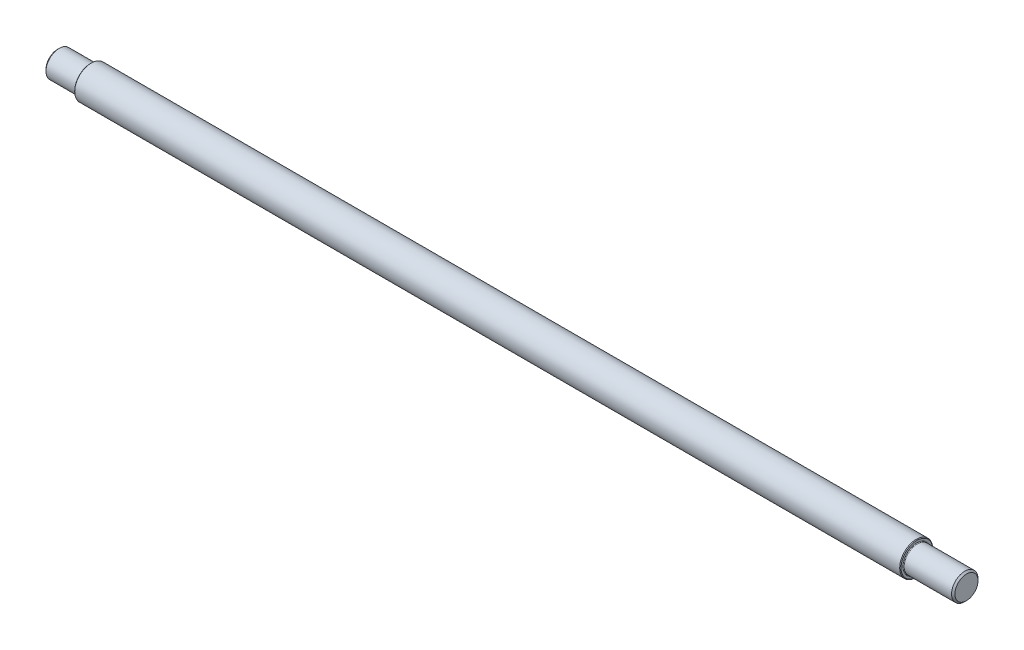
ISO-10303-21;
HEADER;
FILE_DESCRIPTION(('STEP AP214'),'2;1');
FILE_NAME('part.step','',(''),(''),'','','');
FILE_SCHEMA(('AUTOMOTIVE_DESIGN { 1 0 10303 214 1 1 1 1 }'));
ENDSEC;
DATA;
#1=APPLICATION_CONTEXT('core data for automotive mechanical design processes');
#2=APPLICATION_PROTOCOL_DEFINITION('international standard','automotive_design',2000,#1);
#3=PRODUCT_CONTEXT('',#1,'mechanical');
#4=PRODUCT('Part','Part','',(#3));
#5=PRODUCT_RELATED_PRODUCT_CATEGORY('part','',(#4));
#6=PRODUCT_DEFINITION_FORMATION('','',#4);
#7=PRODUCT_DEFINITION_CONTEXT('part definition',#1,'design');
#8=PRODUCT_DEFINITION('design','',#6,#7);
#9=PRODUCT_DEFINITION_SHAPE('','',#8);
#10=(LENGTH_UNIT() NAMED_UNIT(*) SI_UNIT(.MILLI.,.METRE.));
#11=(NAMED_UNIT(*) PLANE_ANGLE_UNIT() SI_UNIT($,.RADIAN.));
#12=(NAMED_UNIT(*) SI_UNIT($,.STERADIAN.) SOLID_ANGLE_UNIT());
#13=UNCERTAINTY_MEASURE_WITH_UNIT(LENGTH_MEASURE(1.E-05),#10,'distance_accuracy_value','');
#14=(GEOMETRIC_REPRESENTATION_CONTEXT(3) GLOBAL_UNCERTAINTY_ASSIGNED_CONTEXT((#13)) GLOBAL_UNIT_ASSIGNED_CONTEXT((#10,
#11,#12)) REPRESENTATION_CONTEXT('',''));
#15=CARTESIAN_POINT('',(0.,0.,0.));
#16=DIRECTION('',(0.,0.,1.));
#17=DIRECTION('',(1.,0.,0.));
#18=AXIS2_PLACEMENT_3D('',#15,#16,#17);
#19=CARTESIAN_POINT('',(275.,4.,0.));
#20=DIRECTION('',(-1.,0.,0.));
#21=DIRECTION('',(0.,0.,1.));
#22=AXIS2_PLACEMENT_3D('',#19,#20,#21);
#23=PLANE('',#22);
#24=CARTESIAN_POINT('',(275.,0.,0.));
#25=DIRECTION('',(-1.,0.,0.));
#26=DIRECTION('',(0.,0.,1.));
#27=AXIS2_PLACEMENT_3D('',#24,#25,#26);
#28=CIRCLE('',#27,3.49999999999995);
#29=CARTESIAN_POINT('',(275.,0.,3.49999999999995));
#30=VERTEX_POINT('',#29);
#31=EDGE_CURVE('E53',#30,#30,#28,.F.);
#32=ORIENTED_EDGE('',*,*,#31,.T.);
#33=EDGE_LOOP('',(#32));
#34=FACE_BOUND('',#33,.T.);
#35=ADVANCED_FACE('F33',(#34),#23,.F.);
#36=CARTESIAN_POINT('',(0.,0.,0.));
#37=DIRECTION('',(-1.,0.,0.));
#38=DIRECTION('',(0.,0.,1.));
#39=AXIS2_PLACEMENT_3D('',#36,#37,#38);
#40=CYLINDRICAL_SURFACE('',#39,4.);
#41=CARTESIAN_POINT('',(260.2,0.,0.));
#42=DIRECTION('',(-1.,0.,0.));
#43=DIRECTION('',(0.,0.,1.));
#44=AXIS2_PLACEMENT_3D('',#41,#42,#43);
#45=CIRCLE('',#44,4.);
#46=CARTESIAN_POINT('',(260.2,0.,4.));
#47=VERTEX_POINT('',#46);
#48=EDGE_CURVE('E10',#47,#47,#45,.F.);
#49=ORIENTED_EDGE('',*,*,#48,.T.);
#50=EDGE_LOOP('',(#49));
#51=FACE_BOUND('',#50,.T.);
#52=CARTESIAN_POINT('',(274.5,0.,0.));
#53=DIRECTION('',(-1.,0.,0.));
#54=DIRECTION('',(0.,0.,1.));
#55=AXIS2_PLACEMENT_3D('',#52,#53,#54);
#56=CIRCLE('',#55,4.);
#57=CARTESIAN_POINT('',(274.5,0.,4.));
#58=VERTEX_POINT('',#57);
#59=EDGE_CURVE('E56',#58,#58,#56,.T.);
#60=ORIENTED_EDGE('',*,*,#59,.T.);
#61=EDGE_LOOP('',(#60));
#62=FACE_BOUND('',#61,.T.);
#63=ADVANCED_FACE('F99',(#51,#62),#40,.T.);
#64=CARTESIAN_POINT('',(260.,4.,0.));
#65=DIRECTION('',(-1.,0.,0.));
#66=DIRECTION('',(0.,0.,1.));
#67=AXIS2_PLACEMENT_3D('',#64,#65,#66);
#68=PLANE('',#67);
#69=CARTESIAN_POINT('',(260.,0.,0.));
#70=DIRECTION('',(-1.,0.,0.));
#71=DIRECTION('',(0.,0.,1.));
#72=AXIS2_PLACEMENT_3D('',#69,#70,#71);
#73=CIRCLE('',#72,4.2);
#74=CARTESIAN_POINT('',(260.,0.,4.2));
#75=VERTEX_POINT('',#74);
#76=EDGE_CURVE('E40',#75,#75,#73,.T.);
#77=ORIENTED_EDGE('',*,*,#76,.T.);
#78=EDGE_LOOP('',(#77));
#79=FACE_BOUND('',#78,.T.);
#80=CARTESIAN_POINT('',(260.,0.,0.));
#81=DIRECTION('',(-1.,0.,0.));
#82=DIRECTION('',(0.,0.,1.));
#83=AXIS2_PLACEMENT_3D('',#80,#81,#82);
#84=CIRCLE('',#83,4.79999999999994);
#85=CARTESIAN_POINT('',(260.,0.,4.79999999999992));
#86=VERTEX_POINT('',#85);
#87=EDGE_CURVE('E71',#86,#86,#84,.F.);
#88=ORIENTED_EDGE('',*,*,#87,.T.);
#89=EDGE_LOOP('',(#88));
#90=FACE_BOUND('',#89,.T.);
#91=ADVANCED_FACE('F104',(#79,#90),#68,.F.);
#92=CARTESIAN_POINT('',(0.,0.,0.));
#93=DIRECTION('',(-1.,0.,0.));
#94=DIRECTION('',(0.,0.,1.));
#95=AXIS2_PLACEMENT_3D('',#92,#93,#94);
#96=CYLINDRICAL_SURFACE('',#95,4.99999999999998);
#97=CARTESIAN_POINT('',(10.2,0.,0.));
#98=DIRECTION('',(1.,0.,0.));
#99=DIRECTION('',(0.,0.,-1.));
#100=AXIS2_PLACEMENT_3D('',#97,#98,#99);
#101=CIRCLE('',#100,4.99999999999998);
#102=CARTESIAN_POINT('',(10.2,0.,-4.99999999999998));
#103=VERTEX_POINT('',#102);
#104=EDGE_CURVE('E65',#103,#103,#101,.T.);
#105=ORIENTED_EDGE('',*,*,#104,.T.);
#106=EDGE_LOOP('',(#105));
#107=FACE_BOUND('',#106,.T.);
#108=CARTESIAN_POINT('',(259.8,0.,0.));
#109=DIRECTION('',(-1.,0.,0.));
#110=DIRECTION('',(0.,0.,1.));
#111=AXIS2_PLACEMENT_3D('',#108,#109,#110);
#112=CIRCLE('',#111,4.99999999999998);
#113=CARTESIAN_POINT('',(259.8,0.,4.99999999999996));
#114=VERTEX_POINT('',#113);
#115=EDGE_CURVE('E74',#114,#114,#112,.T.);
#116=ORIENTED_EDGE('',*,*,#115,.T.);
#117=EDGE_LOOP('',(#116));
#118=FACE_BOUND('',#117,.T.);
#119=ADVANCED_FACE('F78',(#107,#118),#96,.T.);
#120=CARTESIAN_POINT('',(10.,4.99999999999997,0.));
#121=DIRECTION('',(1.,0.,0.));
#122=DIRECTION('',(0.,0.,-1.));
#123=AXIS2_PLACEMENT_3D('',#120,#121,#122);
#124=PLANE('',#123);
#125=CARTESIAN_POINT('',(10.,0.,0.));
#126=DIRECTION('',(1.,0.,0.));
#127=DIRECTION('',(0.,0.,-1.));
#128=AXIS2_PLACEMENT_3D('',#125,#126,#127);
#129=CIRCLE('',#128,4.2);
#130=CARTESIAN_POINT('',(10.,0.,-4.2));
#131=VERTEX_POINT('',#130);
#132=EDGE_CURVE('E44',#131,#131,#129,.T.);
#133=ORIENTED_EDGE('',*,*,#132,.T.);
#134=EDGE_LOOP('',(#133));
#135=FACE_BOUND('',#134,.T.);
#136=CARTESIAN_POINT('',(10.,0.,0.));
#137=DIRECTION('',(1.,0.,0.));
#138=DIRECTION('',(0.,0.,-1.));
#139=AXIS2_PLACEMENT_3D('',#136,#137,#138);
#140=CIRCLE('',#139,4.80000000000005);
#141=CARTESIAN_POINT('',(10.,0.,-4.80000000000005));
#142=VERTEX_POINT('',#141);
#143=EDGE_CURVE('E68',#142,#142,#140,.F.);
#144=ORIENTED_EDGE('',*,*,#143,.T.);
#145=EDGE_LOOP('',(#144));
#146=FACE_BOUND('',#145,.T.);
#147=ADVANCED_FACE('F111',(#135,#146),#124,.F.);
#148=CARTESIAN_POINT('',(0.,0.,0.));
#149=DIRECTION('',(-1.,0.,0.));
#150=DIRECTION('',(0.,0.,1.));
#151=AXIS2_PLACEMENT_3D('',#148,#149,#150);
#152=CYLINDRICAL_SURFACE('',#151,4.);
#153=CARTESIAN_POINT('',(9.8,0.,0.));
#154=DIRECTION('',(1.,0.,0.));
#155=DIRECTION('',(0.,0.,-1.));
#156=AXIS2_PLACEMENT_3D('',#153,#154,#155);
#157=CIRCLE('',#156,4.);
#158=CARTESIAN_POINT('',(9.8,0.,-4.));
#159=VERTEX_POINT('',#158);
#160=EDGE_CURVE('E48',#159,#159,#157,.F.);
#161=ORIENTED_EDGE('',*,*,#160,.T.);
#162=EDGE_LOOP('',(#161));
#163=FACE_BOUND('',#162,.T.);
#164=CARTESIAN_POINT('',(0.499999999999981,0.,0.));
#165=DIRECTION('',(1.,0.,0.));
#166=DIRECTION('',(0.,0.,-1.));
#167=AXIS2_PLACEMENT_3D('',#164,#165,#166);
#168=CIRCLE('',#167,4.);
#169=CARTESIAN_POINT('',(0.499999999999981,0.,-4.));
#170=VERTEX_POINT('',#169);
#171=EDGE_CURVE('E59',#170,#170,#168,.T.);
#172=ORIENTED_EDGE('',*,*,#171,.T.);
#173=EDGE_LOOP('',(#172));
#174=FACE_BOUND('',#173,.T.);
#175=ADVANCED_FACE('F93',(#163,#174),#152,.T.);
#176=CARTESIAN_POINT('',(0.,4.,0.));
#177=DIRECTION('',(1.,0.,0.));
#178=DIRECTION('',(0.,0.,-1.));
#179=AXIS2_PLACEMENT_3D('',#176,#177,#178);
#180=PLANE('',#179);
#181=CARTESIAN_POINT('',(0.,0.,0.));
#182=DIRECTION('',(1.,0.,0.));
#183=DIRECTION('',(0.,0.,-1.));
#184=AXIS2_PLACEMENT_3D('',#181,#182,#183);
#185=CIRCLE('',#184,3.50000000000006);
#186=CARTESIAN_POINT('',(0.,0.,-3.50000000000006));
#187=VERTEX_POINT('',#186);
#188=EDGE_CURVE('E62',#187,#187,#185,.F.);
#189=ORIENTED_EDGE('',*,*,#188,.T.);
#190=EDGE_LOOP('',(#189));
#191=FACE_BOUND('',#190,.T.);
#192=ADVANCED_FACE('F83',(#191),#180,.F.);
#193=CARTESIAN_POINT('',(259.8,0.,0.));
#194=DIRECTION('',(-1.,0.,0.));
#195=DIRECTION('',(0.,0.,1.));
#196=AXIS2_PLACEMENT_3D('',#193,#194,#195);
#197=CONICAL_SURFACE('',#196,4.99999999999998,0.785398163397604);
#198=CARTESIAN_POINT('',(260.,0.,4.79999999999992));
#199=CARTESIAN_POINT('',(259.997916666667,0.,4.80208333333324));
#200=CARTESIAN_POINT('',(259.995833333333,0.,4.80416666666658));
#201=CARTESIAN_POINT('',(259.991666666667,0.,4.80833333333325));
#202=CARTESIAN_POINT('',(259.989583333333,0.,4.81041666666658));
#203=CARTESIAN_POINT('',(259.985416666667,0.,4.81458333333325));
#204=CARTESIAN_POINT('',(259.983333333333,0.,4.81666666666658));
#205=CARTESIAN_POINT('',(259.979166666667,0.,4.82083333333325));
#206=CARTESIAN_POINT('',(259.977083333333,0.,4.82291666666659));
#207=CARTESIAN_POINT('',(259.972916666667,0.,4.82708333333326));
#208=CARTESIAN_POINT('',(259.970833333333,0.,4.82916666666658));
#209=CARTESIAN_POINT('',(259.966666666667,0.,4.83333333333325));
#210=CARTESIAN_POINT('',(259.964583333333,0.,4.83541666666659));
#211=CARTESIAN_POINT('',(259.960416666667,0.,4.83958333333326));
#212=CARTESIAN_POINT('',(259.958333333333,0.,4.84166666666659));
#213=CARTESIAN_POINT('',(259.954166666667,0.,4.84583333333326));
#214=CARTESIAN_POINT('',(259.952083333333,0.,4.8479166666666));
#215=CARTESIAN_POINT('',(259.947916666667,0.,4.85208333333326));
#216=CARTESIAN_POINT('',(259.945833333333,0.,4.85416666666659));
#217=CARTESIAN_POINT('',(259.941666666667,0.,4.85833333333325));
#218=CARTESIAN_POINT('',(259.939583333333,0.,4.86041666666659));
#219=CARTESIAN_POINT('',(259.935416666667,0.,4.86458333333326));
#220=CARTESIAN_POINT('',(259.933333333333,0.,4.86666666666659));
#221=CARTESIAN_POINT('',(259.929166666667,0.,4.87083333333326));
#222=CARTESIAN_POINT('',(259.927083333333,0.,4.8729166666666));
#223=CARTESIAN_POINT('',(259.922916666667,0.,4.87708333333327));
#224=CARTESIAN_POINT('',(259.920833333333,0.,4.87916666666659));
#225=CARTESIAN_POINT('',(259.916666666667,0.,4.88333333333326));
#226=CARTESIAN_POINT('',(259.914583333333,0.,4.8854166666666));
#227=CARTESIAN_POINT('',(259.910416666667,0.,4.88958333333327));
#228=CARTESIAN_POINT('',(259.908333333333,0.,4.8916666666666));
#229=CARTESIAN_POINT('',(259.904166666667,0.,4.89583333333327));
#230=CARTESIAN_POINT('',(259.902083333333,0.,4.89791666666661));
#231=CARTESIAN_POINT('',(259.897916666667,0.,4.90208333333327));
#232=CARTESIAN_POINT('',(259.895833333333,0.,4.9041666666666));
#233=CARTESIAN_POINT('',(259.891666666667,0.,4.90833333333326));
#234=CARTESIAN_POINT('',(259.889583333333,0.,4.9104166666666));
#235=CARTESIAN_POINT('',(259.885416666667,0.,4.91458333333327));
#236=CARTESIAN_POINT('',(259.883333333333,0.,4.9166666666666));
#237=CARTESIAN_POINT('',(259.879166666667,0.,4.92083333333327));
#238=CARTESIAN_POINT('',(259.877083333333,0.,4.92291666666661));
#239=CARTESIAN_POINT('',(259.872916666667,0.,4.92708333333328));
#240=CARTESIAN_POINT('',(259.870833333333,0.,4.9291666666666));
#241=CARTESIAN_POINT('',(259.866666666667,0.,4.93333333333327));
#242=CARTESIAN_POINT('',(259.864583333333,0.,4.93541666666661));
#243=CARTESIAN_POINT('',(259.860416666667,0.,4.93958333333328));
#244=CARTESIAN_POINT('',(259.858333333333,0.,4.94166666666662));
#245=CARTESIAN_POINT('',(259.854166666667,0.,4.94583333333328));
#246=CARTESIAN_POINT('',(259.852083333333,0.,4.94791666666661));
#247=CARTESIAN_POINT('',(259.847916666667,0.,4.95208333333327));
#248=CARTESIAN_POINT('',(259.845833333333,0.,4.95416666666661));
#249=CARTESIAN_POINT('',(259.841666666667,0.,4.95833333333328));
#250=CARTESIAN_POINT('',(259.839583333333,0.,4.96041666666661));
#251=CARTESIAN_POINT('',(259.835416666667,0.,4.96458333333328));
#252=CARTESIAN_POINT('',(259.833333333333,0.,4.96666666666662));
#253=CARTESIAN_POINT('',(259.829166666667,0.,4.97083333333329));
#254=CARTESIAN_POINT('',(259.827083333333,0.,4.97291666666661));
#255=CARTESIAN_POINT('',(259.822916666667,0.,4.97708333333328));
#256=CARTESIAN_POINT('',(259.820833333333,0.,4.97916666666662));
#257=CARTESIAN_POINT('',(259.816666666667,0.,4.98333333333329));
#258=CARTESIAN_POINT('',(259.814583333333,0.,4.98541666666662));
#259=CARTESIAN_POINT('',(259.810416666667,0.,4.98958333333329));
#260=CARTESIAN_POINT('',(259.808333333333,0.,4.99166666666662));
#261=CARTESIAN_POINT('',(259.804166666667,0.,4.99583333333329));
#262=CARTESIAN_POINT('',(259.802083333333,0.,4.99791666666663));
#263=CARTESIAN_POINT('',(259.8,0.,4.99999999999996));
#264=B_SPLINE_CURVE_WITH_KNOTS('',3,(#198,#199,#200,#201,#202,#203,#204,#205,#206,#207,#208,
#209,#210,#211,#212,#213,#214,#215,#216,#217,#218,#219,#220,#221,#222,#223,#224,#225,#226,#227,
#228,#229,#230,#231,#232,#233,#234,#235,#236,#237,#238,#239,#240,#241,#242,#243,#244,#245,#246,
#247,#248,#249,#250,#251,#252,#253,#254,#255,#256,#257,#258,#259,#260,#261,#262,#263),
.UNSPECIFIED.,.F.,.F.,(4,2,2,2,2,2,2,2,2,2,2,2,2,2,2,2,2,2,2,2,2,2,2,2,2,2,2,2,2,2,2,2,4),(0.,
0.00883883476486154,0.0176776695296838,0.0265165042945067,0.035355339059329,0.0441941738241905,
0.0530330085890128,0.0618718433538357,0.070710678118658,0.0795495128835195,0.0883883476483418,
0.0972271824131647,0.106066017177987,0.114904851942849,0.123743686707671,0.132582521472494,
0.141421356237316,0.150260191002178,0.159099025767,0.167937860531823,0.176776695296645,
0.185615530061507,0.194454364826329,0.203293199591152,0.212132034356013,0.220970869120836,
0.229809703885658,0.238648538650481,0.247487373415342,0.256326208180165,0.265165042944987,
0.27400387770981,0.282842712474671),.UNSPECIFIED.);
#265=EDGE_CURVE('BSEAM80',#86,#114,#264,.T.);
#266=ORIENTED_EDGE('',*,*,#87,.F.);
#267=ORIENTED_EDGE('',*,*,#115,.F.);
#268=ORIENTED_EDGE('',*,*,#265,.T.);
#269=ORIENTED_EDGE('',*,*,#265,.F.);
#270=EDGE_LOOP('',(#266,#268,#267,#269));
#271=FACE_BOUND('',#270,.T.);
#272=ADVANCED_FACE('F80',(#271),#197,.T.);
#273=CARTESIAN_POINT('',(10.,0.,0.));
#274=DIRECTION('',(1.,0.,0.));
#275=DIRECTION('',(0.,0.,-1.));
#276=AXIS2_PLACEMENT_3D('',#273,#274,#275);
#277=CONICAL_SURFACE('',#276,4.80000000000005,0.785398163397379);
#278=ORIENTED_EDGE('',*,*,#104,.F.);
#279=EDGE_LOOP('',(#278));
#280=FACE_BOUND('',#279,.T.);
#281=ORIENTED_EDGE('',*,*,#143,.F.);
#282=EDGE_LOOP('',(#281));
#283=FACE_BOUND('',#282,.T.);
#284=ADVANCED_FACE('F82',(#280,#283),#277,.T.);
#285=CARTESIAN_POINT('',(0.,0.,0.));
#286=DIRECTION('',(1.,0.,0.));
#287=DIRECTION('',(0.,0.,-1.));
#288=AXIS2_PLACEMENT_3D('',#285,#286,#287);
#289=CONICAL_SURFACE('',#288,3.50000000000006,0.785398163397407);
#290=ORIENTED_EDGE('',*,*,#171,.F.);
#291=EDGE_LOOP('',(#290));
#292=FACE_BOUND('',#291,.T.);
#293=ORIENTED_EDGE('',*,*,#188,.F.);
#294=EDGE_LOOP('',(#293));
#295=FACE_BOUND('',#294,.T.);
#296=ADVANCED_FACE('F90',(#292,#295),#289,.T.);
#297=CARTESIAN_POINT('',(274.5,0.,0.));
#298=DIRECTION('',(-1.,0.,0.));
#299=DIRECTION('',(0.,0.,1.));
#300=AXIS2_PLACEMENT_3D('',#297,#298,#299);
#301=CONICAL_SURFACE('',#300,4.,0.785398163397445);
#302=ORIENTED_EDGE('',*,*,#31,.F.);
#303=EDGE_LOOP('',(#302));
#304=FACE_BOUND('',#303,.T.);
#305=ORIENTED_EDGE('',*,*,#59,.F.);
#306=EDGE_LOOP('',(#305));
#307=FACE_BOUND('',#306,.T.);
#308=ADVANCED_FACE('F126',(#304,#307),#301,.T.);
#309=CARTESIAN_POINT('',(9.8,0.,0.));
#310=DIRECTION('',(1.,0.,0.));
#311=DIRECTION('',(0.,0.,-1.));
#312=AXIS2_PLACEMENT_3D('',#309,#310,#311);
#313=TOROIDAL_SURFACE('',#312,4.2,0.2);
#314=ORIENTED_EDGE('',*,*,#132,.F.);
#315=EDGE_LOOP('',(#314));
#316=FACE_BOUND('',#315,.T.);
#317=ORIENTED_EDGE('',*,*,#160,.F.);
#318=EDGE_LOOP('',(#317));
#319=FACE_BOUND('',#318,.T.);
#320=ADVANCED_FACE('F132',(#316,#319),#313,.F.);
#321=CARTESIAN_POINT('',(260.2,0.,0.));
#322=DIRECTION('',(-1.,0.,0.));
#323=DIRECTION('',(0.,0.,1.));
#324=AXIS2_PLACEMENT_3D('',#321,#322,#323);
#325=TOROIDAL_SURFACE('',#324,4.2,0.2);
#326=ORIENTED_EDGE('',*,*,#48,.F.);
#327=EDGE_LOOP('',(#326));
#328=FACE_BOUND('',#327,.T.);
#329=ORIENTED_EDGE('',*,*,#76,.F.);
#330=EDGE_LOOP('',(#329));
#331=FACE_BOUND('',#330,.T.);
#332=ADVANCED_FACE('F35',(#328,#331),#325,.F.);
#333=CLOSED_SHELL('',(#35,#63,#91,#119,#147,#175,#192,#272,#284,#296,#308,#320,#332));
#334=MANIFOLD_SOLID_BREP('B2',#333);
#335=ADVANCED_BREP_SHAPE_REPRESENTATION('',(#18,#334),#14);
#336=SHAPE_DEFINITION_REPRESENTATION(#9,#335);
ENDSEC;
END-ISO-10303-21;
